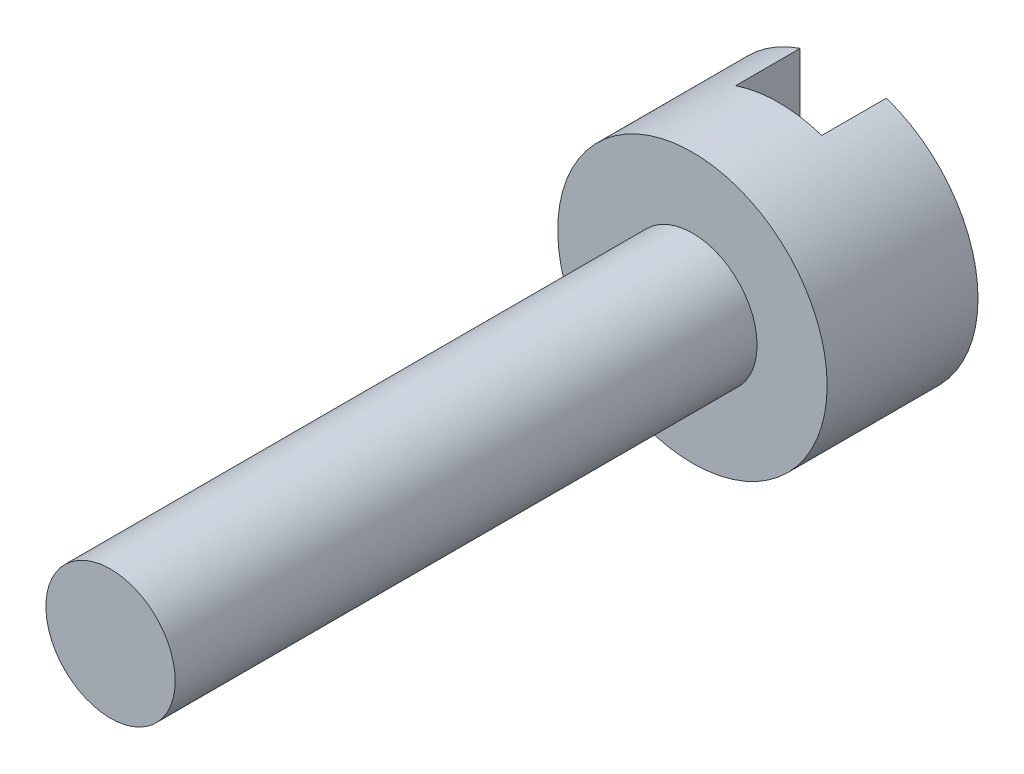
ISO-10303-21;
HEADER;
FILE_DESCRIPTION(('STEP AP214'),'2;1');
FILE_NAME('part.step','',(''),(''),'','','');
FILE_SCHEMA(('AUTOMOTIVE_DESIGN { 1 0 10303 214 1 1 1 1 }'));
ENDSEC;
DATA;
#1=APPLICATION_CONTEXT('core data for automotive mechanical design processes');
#2=APPLICATION_PROTOCOL_DEFINITION('international standard','automotive_design',2000,#1);
#3=PRODUCT_CONTEXT('',#1,'mechanical');
#4=PRODUCT('Part','Part','',(#3));
#5=PRODUCT_RELATED_PRODUCT_CATEGORY('part','',(#4));
#6=PRODUCT_DEFINITION_FORMATION('','',#4);
#7=PRODUCT_DEFINITION_CONTEXT('part definition',#1,'design');
#8=PRODUCT_DEFINITION('design','',#6,#7);
#9=PRODUCT_DEFINITION_SHAPE('','',#8);
#10=(LENGTH_UNIT() NAMED_UNIT(*) SI_UNIT(.MILLI.,.METRE.));
#11=(NAMED_UNIT(*) PLANE_ANGLE_UNIT() SI_UNIT($,.RADIAN.));
#12=(NAMED_UNIT(*) SI_UNIT($,.STERADIAN.) SOLID_ANGLE_UNIT());
#13=UNCERTAINTY_MEASURE_WITH_UNIT(LENGTH_MEASURE(1.E-05),#10,'distance_accuracy_value','');
#14=(GEOMETRIC_REPRESENTATION_CONTEXT(3) GLOBAL_UNCERTAINTY_ASSIGNED_CONTEXT((#13)) GLOBAL_UNIT_ASSIGNED_CONTEXT((#10,
#11,#12)) REPRESENTATION_CONTEXT('',''));
#15=CARTESIAN_POINT('',(0.,0.,0.));
#16=DIRECTION('',(0.,0.,1.));
#17=DIRECTION('',(1.,0.,0.));
#18=AXIS2_PLACEMENT_3D('',#15,#16,#17);
#19=CARTESIAN_POINT('',(0.,0.,0.));
#20=DIRECTION('',(0.,0.,1.));
#21=DIRECTION('',(1.,0.,0.));
#22=AXIS2_PLACEMENT_3D('',#19,#20,#21);
#23=PLANE('',#22);
#24=CARTESIAN_POINT('',(0.,0.,0.));
#25=DIRECTION('',(0.,0.,1.));
#26=DIRECTION('',(1.,0.,0.));
#27=AXIS2_PLACEMENT_3D('',#24,#25,#26);
#28=CIRCLE('',#27,0.625);
#29=CARTESIAN_POINT('',(-0.2,0.592135964116351,0.));
#30=VERTEX_POINT('',#29);
#31=CARTESIAN_POINT('',(-0.2,-0.59213596411635,0.));
#32=VERTEX_POINT('',#31);
#33=EDGE_CURVE('E93',#30,#32,#28,.T.);
#34=ORIENTED_EDGE('',*,*,#33,.F.);
#35=DIRECTION('',(0.,-1.,0.));
#36=VECTOR('',#35,1.);
#37=CARTESIAN_POINT('',(-0.2,0.,0.));
#38=LINE('',#37,#36);
#39=EDGE_CURVE('E81',#30,#32,#38,.T.);
#40=ORIENTED_EDGE('',*,*,#39,.T.);
#41=EDGE_LOOP('',(#34,#40));
#42=FACE_BOUND('',#41,.T.);
#43=ADVANCED_FACE('F34',(#42),#23,.F.);
#44=CARTESIAN_POINT('',(0.,0.,0.7));
#45=DIRECTION('',(0.,0.,1.));
#46=DIRECTION('',(1.,0.,0.));
#47=AXIS2_PLACEMENT_3D('',#44,#45,#46);
#48=PLANE('',#47);
#49=CARTESIAN_POINT('',(0.,0.,0.7));
#50=DIRECTION('',(0.,0.,1.));
#51=DIRECTION('',(1.,0.,0.));
#52=AXIS2_PLACEMENT_3D('',#49,#50,#51);
#53=CIRCLE('',#52,0.625);
#54=CARTESIAN_POINT('',(0.625,0.,0.7));
#55=VERTEX_POINT('',#54);
#56=EDGE_CURVE('E82',#55,#55,#53,.T.);
#57=ORIENTED_EDGE('',*,*,#56,.T.);
#58=EDGE_LOOP('',(#57));
#59=FACE_BOUND('',#58,.T.);
#60=CARTESIAN_POINT('',(0.,0.,0.7));
#61=DIRECTION('',(0.,0.,1.));
#62=DIRECTION('',(1.,0.,0.));
#63=AXIS2_PLACEMENT_3D('',#60,#61,#62);
#64=CIRCLE('',#63,0.3);
#65=CARTESIAN_POINT('',(0.3,0.,0.7));
#66=VERTEX_POINT('',#65);
#67=EDGE_CURVE('E98',#66,#66,#64,.T.);
#68=ORIENTED_EDGE('',*,*,#67,.F.);
#69=EDGE_LOOP('',(#68));
#70=FACE_BOUND('',#69,.T.);
#71=ADVANCED_FACE('F119',(#59,#70),#48,.T.);
#72=CARTESIAN_POINT('',(0.,0.,0.7));
#73=DIRECTION('',(0.,0.,-1.));
#74=DIRECTION('',(-1.,0.,0.));
#75=AXIS2_PLACEMENT_3D('',#72,#73,#74);
#76=CYLINDRICAL_SURFACE('',#75,0.625);
#77=CARTESIAN_POINT('',(0.,0.,0.3));
#78=DIRECTION('',(0.,0.,-1.));
#79=DIRECTION('',(-1.,0.,0.));
#80=AXIS2_PLACEMENT_3D('',#77,#78,#79);
#81=CIRCLE('',#80,0.625);
#82=CARTESIAN_POINT('',(-0.2,0.592135964116351,0.3));
#83=VERTEX_POINT('',#82);
#84=CARTESIAN_POINT('',(0.2,0.592135964116351,0.3));
#85=VERTEX_POINT('',#84);
#86=EDGE_CURVE('E11',#83,#85,#81,.T.);
#87=ORIENTED_EDGE('',*,*,#86,.F.);
#88=DIRECTION('',(0.,0.,-1.));
#89=VECTOR('',#88,1.);
#90=CARTESIAN_POINT('',(-0.2,0.592135964116351,0.7));
#91=LINE('',#90,#89);
#92=EDGE_CURVE('E57',#83,#30,#91,.T.);
#93=ORIENTED_EDGE('',*,*,#92,.T.);
#94=ORIENTED_EDGE('',*,*,#33,.T.);
#95=DIRECTION('',(0.,0.,-1.));
#96=VECTOR('',#95,1.);
#97=CARTESIAN_POINT('',(-0.2,-0.592135964116351,0.7));
#98=LINE('',#97,#96);
#99=CARTESIAN_POINT('',(-0.2,-0.592135964116351,0.3));
#100=VERTEX_POINT('',#99);
#101=EDGE_CURVE('E90',#32,#100,#98,.F.);
#102=ORIENTED_EDGE('',*,*,#101,.T.);
#103=CARTESIAN_POINT('',(0.2,-0.592135964116351,0.3));
#104=VERTEX_POINT('',#103);
#105=EDGE_CURVE('E38',#104,#100,#81,.T.);
#106=ORIENTED_EDGE('',*,*,#105,.F.);
#107=DIRECTION('',(0.,0.,-1.));
#108=VECTOR('',#107,1.);
#109=CARTESIAN_POINT('',(0.2,-0.592135964116351,0.7));
#110=LINE('',#109,#108);
#111=CARTESIAN_POINT('',(0.2,-0.59213596411635,0.));
#112=VERTEX_POINT('',#111);
#113=EDGE_CURVE('E76',#104,#112,#110,.T.);
#114=ORIENTED_EDGE('',*,*,#113,.T.);
#115=CARTESIAN_POINT('',(0.2,0.592135964116351,0.));
#116=VERTEX_POINT('',#115);
#117=EDGE_CURVE('E88',#112,#116,#28,.T.);
#118=ORIENTED_EDGE('',*,*,#117,.T.);
#119=DIRECTION('',(0.,0.,-1.));
#120=VECTOR('',#119,1.);
#121=CARTESIAN_POINT('',(0.2,0.592135964116351,0.7));
#122=LINE('',#121,#120);
#123=EDGE_CURVE('E49',#116,#85,#122,.F.);
#124=ORIENTED_EDGE('',*,*,#123,.T.);
#125=EDGE_LOOP('',(#87,#93,#94,#102,#106,#114,#118,#124));
#126=FACE_BOUND('',#125,.T.);
#127=ORIENTED_EDGE('',*,*,#56,.F.);
#128=EDGE_LOOP('',(#127));
#129=FACE_BOUND('',#128,.T.);
#130=ADVANCED_FACE('F36',(#126,#129),#76,.T.);
#131=ORIENTED_EDGE('',*,*,#117,.F.);
#132=DIRECTION('',(0.,1.,0.));
#133=VECTOR('',#132,1.);
#134=CARTESIAN_POINT('',(0.2,0.,0.));
#135=LINE('',#134,#133);
#136=EDGE_CURVE('E73',#112,#116,#135,.T.);
#137=ORIENTED_EDGE('',*,*,#136,.T.);
#138=EDGE_LOOP('',(#131,#137));
#139=FACE_BOUND('',#138,.T.);
#140=ADVANCED_FACE('F92',(#139),#23,.F.);
#141=CARTESIAN_POINT('',(0.,0.,3.4));
#142=DIRECTION('',(0.,0.,-1.));
#143=DIRECTION('',(-1.,0.,0.));
#144=AXIS2_PLACEMENT_3D('',#141,#142,#143);
#145=CYLINDRICAL_SURFACE('',#144,0.3);
#146=CARTESIAN_POINT('',(0.,0.,3.4));
#147=DIRECTION('',(0.,0.,1.));
#148=DIRECTION('',(1.,0.,0.));
#149=AXIS2_PLACEMENT_3D('',#146,#147,#148);
#150=CIRCLE('',#149,0.3);
#151=CARTESIAN_POINT('',(0.3,0.,3.4));
#152=VERTEX_POINT('',#151);
#153=EDGE_CURVE('E94',#152,#152,#150,.T.);
#154=ORIENTED_EDGE('',*,*,#153,.F.);
#155=EDGE_LOOP('',(#154));
#156=FACE_BOUND('',#155,.T.);
#157=ORIENTED_EDGE('',*,*,#67,.T.);
#158=EDGE_LOOP('',(#157));
#159=FACE_BOUND('',#158,.T.);
#160=ADVANCED_FACE('F117',(#156,#159),#145,.T.);
#161=CARTESIAN_POINT('',(0.,0.,3.4));
#162=DIRECTION('',(0.,0.,1.));
#163=DIRECTION('',(1.,0.,0.));
#164=AXIS2_PLACEMENT_3D('',#161,#162,#163);
#165=PLANE('',#164);
#166=ORIENTED_EDGE('',*,*,#153,.T.);
#167=EDGE_LOOP('',(#166));
#168=FACE_BOUND('',#167,.T.);
#169=ADVANCED_FACE('F134',(#168),#165,.T.);
#170=CARTESIAN_POINT('',(-0.2,-1.,0.3));
#171=DIRECTION('',(0.,0.,-1.));
#172=DIRECTION('',(-1.,0.,0.));
#173=AXIS2_PLACEMENT_3D('',#170,#171,#172);
#174=PLANE('',#173);
#175=ORIENTED_EDGE('',*,*,#86,.T.);
#176=DIRECTION('',(0.,-1.,0.));
#177=VECTOR('',#176,1.);
#178=CARTESIAN_POINT('',(0.2,1.,0.3));
#179=LINE('',#178,#177);
#180=EDGE_CURVE('E108',#85,#104,#179,.T.);
#181=ORIENTED_EDGE('',*,*,#180,.T.);
#182=ORIENTED_EDGE('',*,*,#105,.T.);
#183=DIRECTION('',(0.,1.,0.));
#184=VECTOR('',#183,1.);
#185=CARTESIAN_POINT('',(-0.2,1.,0.3));
#186=LINE('',#185,#184);
#187=EDGE_CURVE('E107',#100,#83,#186,.T.);
#188=ORIENTED_EDGE('',*,*,#187,.T.);
#189=EDGE_LOOP('',(#175,#181,#182,#188));
#190=FACE_BOUND('',#189,.T.);
#191=ADVANCED_FACE('F106',(#190),#174,.T.);
#192=CARTESIAN_POINT('',(-0.2,1.,0.3));
#193=DIRECTION('',(-1.,0.,0.));
#194=DIRECTION('',(0.,-1.,0.));
#195=AXIS2_PLACEMENT_3D('',#192,#193,#194);
#196=PLANE('',#195);
#197=ORIENTED_EDGE('',*,*,#187,.F.);
#198=ORIENTED_EDGE('',*,*,#101,.F.);
#199=ORIENTED_EDGE('',*,*,#39,.F.);
#200=ORIENTED_EDGE('',*,*,#92,.F.);
#201=EDGE_LOOP('',(#197,#198,#199,#200));
#202=FACE_BOUND('',#201,.T.);
#203=ADVANCED_FACE('F109',(#202),#196,.F.);
#204=CARTESIAN_POINT('',(0.2,1.,0.3));
#205=DIRECTION('',(1.,0.,0.));
#206=DIRECTION('',(0.,1.,0.));
#207=AXIS2_PLACEMENT_3D('',#204,#205,#206);
#208=PLANE('',#207);
#209=ORIENTED_EDGE('',*,*,#180,.F.);
#210=ORIENTED_EDGE('',*,*,#123,.F.);
#211=ORIENTED_EDGE('',*,*,#136,.F.);
#212=ORIENTED_EDGE('',*,*,#113,.F.);
#213=EDGE_LOOP('',(#209,#210,#211,#212));
#214=FACE_BOUND('',#213,.T.);
#215=ADVANCED_FACE('F75',(#214),#208,.F.);
#216=CLOSED_SHELL('',(#43,#71,#130,#140,#160,#169,#191,#203,#215));
#217=MANIFOLD_SOLID_BREP('B2',#216);
#218=ADVANCED_BREP_SHAPE_REPRESENTATION('',(#18,#217),#14);
#219=SHAPE_DEFINITION_REPRESENTATION(#9,#218);
ENDSEC;
END-ISO-10303-21;
